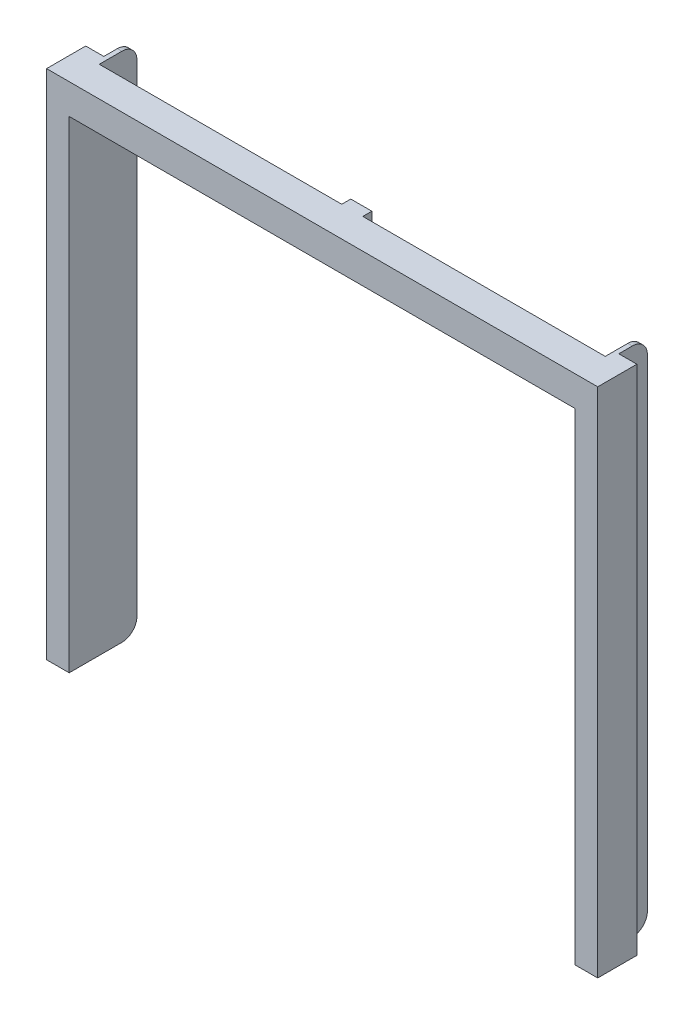
ISO-10303-21;
HEADER;
FILE_DESCRIPTION(('STEP AP214'),'2;1');
FILE_NAME('part.step','',(''),(''),'','','');
FILE_SCHEMA(('AUTOMOTIVE_DESIGN { 1 0 10303 214 1 1 1 1 }'));
ENDSEC;
DATA;
#1=APPLICATION_CONTEXT('core data for automotive mechanical design processes');
#2=APPLICATION_PROTOCOL_DEFINITION('international standard','automotive_design',2000,#1);
#3=PRODUCT_CONTEXT('',#1,'mechanical');
#4=PRODUCT('Part','Part','',(#3));
#5=PRODUCT_RELATED_PRODUCT_CATEGORY('part','',(#4));
#6=PRODUCT_DEFINITION_FORMATION('','',#4);
#7=PRODUCT_DEFINITION_CONTEXT('part definition',#1,'design');
#8=PRODUCT_DEFINITION('design','',#6,#7);
#9=PRODUCT_DEFINITION_SHAPE('','',#8);
#10=(LENGTH_UNIT() NAMED_UNIT(*) SI_UNIT(.MILLI.,.METRE.));
#11=(NAMED_UNIT(*) PLANE_ANGLE_UNIT() SI_UNIT($,.RADIAN.));
#12=(NAMED_UNIT(*) SI_UNIT($,.STERADIAN.) SOLID_ANGLE_UNIT());
#13=UNCERTAINTY_MEASURE_WITH_UNIT(LENGTH_MEASURE(1.E-05),#10,'distance_accuracy_value','');
#14=(GEOMETRIC_REPRESENTATION_CONTEXT(3) GLOBAL_UNCERTAINTY_ASSIGNED_CONTEXT((#13)) GLOBAL_UNIT_ASSIGNED_CONTEXT((#10,
#11,#12)) REPRESENTATION_CONTEXT('',''));
#15=CARTESIAN_POINT('',(0.,0.,0.));
#16=DIRECTION('',(0.,0.,1.));
#17=DIRECTION('',(1.,0.,0.));
#18=AXIS2_PLACEMENT_3D('',#15,#16,#17);
#19=CARTESIAN_POINT('',(0.,0.,0.));
#20=DIRECTION('',(0.,0.,1.));
#21=DIRECTION('',(1.,0.,0.));
#22=AXIS2_PLACEMENT_3D('',#19,#20,#21);
#23=PLANE('',#22);
#24=DIRECTION('',(0.,1.,0.));
#25=VECTOR('',#24,1.);
#26=CARTESIAN_POINT('',(-7.,-52.,0.));
#27=LINE('',#26,#25);
#28=CARTESIAN_POINT('',(-7.,-20.,0.));
#29=VERTEX_POINT('',#28);
#30=CARTESIAN_POINT('',(-7.00000000000001,0.,0.));
#31=VERTEX_POINT('',#30);
#32=EDGE_CURVE('E195',#29,#31,#27,.T.);
#33=ORIENTED_EDGE('',*,*,#32,.T.);
#34=DIRECTION('',(1.,0.,0.));
#35=VECTOR('',#34,1.);
#36=CARTESIAN_POINT('',(168.,0.,0.));
#37=LINE('',#36,#35);
#38=CARTESIAN_POINT('',(7.,0.,0.));
#39=VERTEX_POINT('',#38);
#40=EDGE_CURVE('E207',#31,#39,#37,.T.);
#41=ORIENTED_EDGE('',*,*,#40,.T.);
#42=DIRECTION('',(0.,1.,0.));
#43=VECTOR('',#42,1.);
#44=CARTESIAN_POINT('',(7.00000000000001,-52.,0.));
#45=LINE('',#44,#43);
#46=CARTESIAN_POINT('',(7.,-20.,0.));
#47=VERTEX_POINT('',#46);
#48=EDGE_CURVE('E220',#47,#39,#45,.T.);
#49=ORIENTED_EDGE('',*,*,#48,.F.);
#50=DIRECTION('',(1.,0.,0.));
#51=VECTOR('',#50,1.);
#52=CARTESIAN_POINT('',(-168.,-20.,0.));
#53=LINE('',#52,#51);
#54=EDGE_CURVE('E265',#29,#47,#53,.T.);
#55=ORIENTED_EDGE('',*,*,#54,.F.);
#56=EDGE_LOOP('',(#33,#41,#49,#55));
#57=FACE_BOUND('',#56,.T.);
#58=ADVANCED_FACE('F35',(#57),#23,.F.);
#59=CARTESIAN_POINT('',(-168.,-20.,26.));
#60=DIRECTION('',(0.,1.,0.));
#61=DIRECTION('',(-1.,0.,0.));
#62=AXIS2_PLACEMENT_3D('',#59,#60,#61);
#63=PLANE('',#62);
#64=DIRECTION('',(0.,0.,1.));
#65=VECTOR('',#64,1.);
#66=CARTESIAN_POINT('',(-7.00000000000001,-20.,26.));
#67=LINE('',#66,#65);
#68=CARTESIAN_POINT('',(-7.,-20.,6.00000000000002));
#69=VERTEX_POINT('',#68);
#70=EDGE_CURVE('E192',#29,#69,#67,.T.);
#71=ORIENTED_EDGE('',*,*,#70,.F.);
#72=ORIENTED_EDGE('',*,*,#54,.T.);
#73=DIRECTION('',(0.,0.,1.));
#74=VECTOR('',#73,1.);
#75=CARTESIAN_POINT('',(7.00000000000001,-20.,26.));
#76=LINE('',#75,#74);
#77=CARTESIAN_POINT('',(7.,-20.,6.00000000000002));
#78=VERTEX_POINT('',#77);
#79=EDGE_CURVE('E211',#47,#78,#76,.T.);
#80=ORIENTED_EDGE('',*,*,#79,.T.);
#81=DIRECTION('',(1.,0.,0.));
#82=VECTOR('',#81,1.);
#83=CARTESIAN_POINT('',(-168.,-20.,6.00000000000002));
#84=LINE('',#83,#82);
#85=CARTESIAN_POINT('',(168.,-19.9999999999999,6.00000000000002));
#86=VERTEX_POINT('',#85);
#87=EDGE_CURVE('E226',#78,#86,#84,.T.);
#88=ORIENTED_EDGE('',*,*,#87,.T.);
#89=DIRECTION('',(0.,0.,-1.));
#90=VECTOR('',#89,1.);
#91=CARTESIAN_POINT('',(168.,-19.9999999999999,26.));
#92=LINE('',#91,#90);
#93=CARTESIAN_POINT('',(168.,-19.9999999999999,26.));
#94=VERTEX_POINT('',#93);
#95=EDGE_CURVE('E302',#94,#86,#92,.T.);
#96=ORIENTED_EDGE('',*,*,#95,.F.);
#97=DIRECTION('',(1.,0.,0.));
#98=VECTOR('',#97,1.);
#99=CARTESIAN_POINT('',(-168.,-20.,26.));
#100=LINE('',#99,#98);
#101=CARTESIAN_POINT('',(-168.,-20.,26.));
#102=VERTEX_POINT('',#101);
#103=EDGE_CURVE('E279',#102,#94,#100,.T.);
#104=ORIENTED_EDGE('',*,*,#103,.F.);
#105=DIRECTION('',(0.,0.,-1.));
#106=VECTOR('',#105,1.);
#107=CARTESIAN_POINT('',(-168.,-20.,26.));
#108=LINE('',#107,#106);
#109=CARTESIAN_POINT('',(-168.,-20.,6.00000000000002));
#110=VERTEX_POINT('',#109);
#111=EDGE_CURVE('E298',#102,#110,#108,.T.);
#112=ORIENTED_EDGE('',*,*,#111,.T.);
#113=DIRECTION('',(1.,0.,0.));
#114=VECTOR('',#113,1.);
#115=CARTESIAN_POINT('',(-168.,-20.,6.00000000000002));
#116=LINE('',#115,#114);
#117=EDGE_CURVE('E229',#110,#69,#116,.T.);
#118=ORIENTED_EDGE('',*,*,#117,.T.);
#119=EDGE_LOOP('',(#71,#72,#80,#88,#96,#104,#112,#118));
#120=FACE_BOUND('',#119,.T.);
#121=ADVANCED_FACE('F383',(#120),#63,.F.);
#122=DIRECTION('',(0.,1.,0.));
#123=VECTOR('',#122,1.);
#124=CARTESIAN_POINT('',(-171.,0.,0.));
#125=LINE('',#124,#123);
#126=CARTESIAN_POINT('',(-171.,-340.,0.));
#127=VERTEX_POINT('',#126);
#128=CARTESIAN_POINT('',(-171.,0.,0.));
#129=VERTEX_POINT('',#128);
#130=EDGE_CURVE('E232',#127,#129,#125,.T.);
#131=ORIENTED_EDGE('',*,*,#130,.F.);
#132=DIRECTION('',(1.,0.,0.));
#133=VECTOR('',#132,1.);
#134=CARTESIAN_POINT('',(-183.,-340.,0.));
#135=LINE('',#134,#133);
#136=CARTESIAN_POINT('',(-183.,-340.,0.));
#137=VERTEX_POINT('',#136);
#138=EDGE_CURVE('E257',#137,#127,#135,.T.);
#139=ORIENTED_EDGE('',*,*,#138,.F.);
#140=DIRECTION('',(0.,-1.,0.));
#141=VECTOR('',#140,1.);
#142=CARTESIAN_POINT('',(-183.,0.,0.));
#143=LINE('',#142,#141);
#144=CARTESIAN_POINT('',(-183.,0.,0.));
#145=VERTEX_POINT('',#144);
#146=EDGE_CURVE('E284',#145,#137,#143,.T.);
#147=ORIENTED_EDGE('',*,*,#146,.F.);
#148=EDGE_CURVE('E287',#145,#129,#37,.T.);
#149=ORIENTED_EDGE('',*,*,#148,.T.);
#150=EDGE_LOOP('',(#131,#139,#147,#149));
#151=FACE_BOUND('',#150,.T.);
#152=ADVANCED_FACE('F415',(#151),#23,.F.);
#153=CARTESIAN_POINT('',(-168.,-20.,26.));
#154=DIRECTION('',(1.,0.,0.));
#155=DIRECTION('',(0.,1.,0.));
#156=AXIS2_PLACEMENT_3D('',#153,#154,#155);
#157=PLANE('',#156);
#158=DIRECTION('',(0.,0.,1.));
#159=VECTOR('',#158,1.);
#160=CARTESIAN_POINT('',(-168.,0.,-19.));
#161=LINE('',#160,#159);
#162=CARTESIAN_POINT('',(-168.,0.,-9.));
#163=VERTEX_POINT('',#162);
#164=CARTESIAN_POINT('',(-168.,0.,6.00000000000002));
#165=VERTEX_POINT('',#164);
#166=EDGE_CURVE('E50',#163,#165,#161,.T.);
#167=ORIENTED_EDGE('',*,*,#166,.T.);
#168=DIRECTION('',(0.,1.,0.));
#169=VECTOR('',#168,1.);
#170=CARTESIAN_POINT('',(-168.,-52.,6.00000000000002));
#171=LINE('',#170,#169);
#172=EDGE_CURVE('E196',#110,#165,#171,.T.);
#173=ORIENTED_EDGE('',*,*,#172,.F.);
#174=ORIENTED_EDGE('',*,*,#111,.F.);
#175=DIRECTION('',(0.,-1.,0.));
#176=VECTOR('',#175,1.);
#177=CARTESIAN_POINT('',(-168.,-20.,26.));
#178=LINE('',#177,#176);
#179=CARTESIAN_POINT('',(-168.,-340.,26.));
#180=VERTEX_POINT('',#179);
#181=EDGE_CURVE('E261',#102,#180,#178,.T.);
#182=ORIENTED_EDGE('',*,*,#181,.T.);
#183=DIRECTION('',(0.,0.,-1.));
#184=VECTOR('',#183,1.);
#185=CARTESIAN_POINT('',(-168.,-340.,26.));
#186=LINE('',#185,#184);
#187=CARTESIAN_POINT('',(-168.,-340.,-8.99999999999998));
#188=VERTEX_POINT('',#187);
#189=EDGE_CURVE('E281',#180,#188,#186,.T.);
#190=ORIENTED_EDGE('',*,*,#189,.T.);
#191=CARTESIAN_POINT('',(-168.,-330.,-9.));
#192=DIRECTION('',(1.,0.,0.));
#193=DIRECTION('',(0.,1.,0.));
#194=AXIS2_PLACEMENT_3D('',#191,#192,#193);
#195=CIRCLE('',#194,10.);
#196=CARTESIAN_POINT('',(-168.,-330.,-19.));
#197=VERTEX_POINT('',#196);
#198=EDGE_CURVE('E333',#188,#197,#195,.T.);
#199=ORIENTED_EDGE('',*,*,#198,.T.);
#200=DIRECTION('',(0.,-1.,0.));
#201=VECTOR('',#200,1.);
#202=CARTESIAN_POINT('',(-168.,0.,-19.));
#203=LINE('',#202,#201);
#204=CARTESIAN_POINT('',(-168.,-10.,-19.));
#205=VERTEX_POINT('',#204);
#206=EDGE_CURVE('E233',#205,#197,#203,.T.);
#207=ORIENTED_EDGE('',*,*,#206,.F.);
#208=CARTESIAN_POINT('',(-168.,-10.,-9.));
#209=DIRECTION('',(1.,0.,0.));
#210=DIRECTION('',(0.,1.,0.));
#211=AXIS2_PLACEMENT_3D('',#208,#209,#210);
#212=CIRCLE('',#211,10.);
#213=EDGE_CURVE('E335',#205,#163,#212,.T.);
#214=ORIENTED_EDGE('',*,*,#213,.T.);
#215=EDGE_LOOP('',(#167,#173,#174,#182,#190,#199,#207,#214));
#216=FACE_BOUND('',#215,.T.);
#217=ADVANCED_FACE('F385',(#216),#157,.T.);
#218=CARTESIAN_POINT('',(168.,-19.9999999999999,26.));
#219=DIRECTION('',(1.,0.,0.));
#220=DIRECTION('',(0.,1.,0.));
#221=AXIS2_PLACEMENT_3D('',#218,#219,#220);
#222=PLANE('',#221);
#223=ORIENTED_EDGE('',*,*,#95,.T.);
#224=DIRECTION('',(0.,1.,0.));
#225=VECTOR('',#224,1.);
#226=CARTESIAN_POINT('',(168.,-52.,6.00000000000002));
#227=LINE('',#226,#225);
#228=CARTESIAN_POINT('',(168.,0.,6.00000000000002));
#229=VERTEX_POINT('',#228);
#230=EDGE_CURVE('E218',#86,#229,#227,.T.);
#231=ORIENTED_EDGE('',*,*,#230,.T.);
#232=DIRECTION('',(0.,0.,1.));
#233=VECTOR('',#232,1.);
#234=CARTESIAN_POINT('',(168.,0.,-19.));
#235=LINE('',#234,#233);
#236=CARTESIAN_POINT('',(168.,0.,-9.));
#237=VERTEX_POINT('',#236);
#238=EDGE_CURVE('E58',#237,#229,#235,.T.);
#239=ORIENTED_EDGE('',*,*,#238,.F.);
#240=CARTESIAN_POINT('',(168.,-9.99999999999996,-9.));
#241=DIRECTION('',(1.,0.,0.));
#242=DIRECTION('',(0.,1.,0.));
#243=AXIS2_PLACEMENT_3D('',#240,#241,#242);
#244=CIRCLE('',#243,10.);
#245=CARTESIAN_POINT('',(168.,-9.99999999999996,-19.));
#246=VERTEX_POINT('',#245);
#247=EDGE_CURVE('E349',#237,#246,#244,.F.);
#248=ORIENTED_EDGE('',*,*,#247,.T.);
#249=DIRECTION('',(0.,1.,0.));
#250=VECTOR('',#249,1.);
#251=CARTESIAN_POINT('',(168.,0.,-19.));
#252=LINE('',#251,#250);
#253=CARTESIAN_POINT('',(168.,-330.,-19.));
#254=VERTEX_POINT('',#253);
#255=EDGE_CURVE('E247',#254,#246,#252,.T.);
#256=ORIENTED_EDGE('',*,*,#255,.F.);
#257=CARTESIAN_POINT('',(168.,-330.,-9.));
#258=DIRECTION('',(1.,0.,0.));
#259=DIRECTION('',(0.,1.,0.));
#260=AXIS2_PLACEMENT_3D('',#257,#258,#259);
#261=CIRCLE('',#260,10.);
#262=CARTESIAN_POINT('',(168.,-340.,-8.99999999999998));
#263=VERTEX_POINT('',#262);
#264=EDGE_CURVE('E347',#254,#263,#261,.F.);
#265=ORIENTED_EDGE('',*,*,#264,.T.);
#266=DIRECTION('',(0.,0.,-1.));
#267=VECTOR('',#266,1.);
#268=CARTESIAN_POINT('',(168.,-340.,26.));
#269=LINE('',#268,#267);
#270=CARTESIAN_POINT('',(168.,-340.,26.));
#271=VERTEX_POINT('',#270);
#272=EDGE_CURVE('E305',#271,#263,#269,.T.);
#273=ORIENTED_EDGE('',*,*,#272,.F.);
#274=DIRECTION('',(0.,-1.,0.));
#275=VECTOR('',#274,1.);
#276=CARTESIAN_POINT('',(168.,-19.9999999999999,26.));
#277=LINE('',#276,#275);
#278=EDGE_CURVE('E277',#94,#271,#277,.T.);
#279=ORIENTED_EDGE('',*,*,#278,.F.);
#280=EDGE_LOOP('',(#223,#231,#239,#248,#256,#265,#273,#279));
#281=FACE_BOUND('',#280,.T.);
#282=ADVANCED_FACE('F369',(#281),#222,.F.);
#283=CARTESIAN_POINT('',(183.,-340.,26.));
#284=DIRECTION('',(0.,-1.,0.));
#285=DIRECTION('',(0.,0.,-1.));
#286=AXIS2_PLACEMENT_3D('',#283,#284,#285);
#287=PLANE('',#286);
#288=ORIENTED_EDGE('',*,*,#272,.T.);
#289=DIRECTION('',(-1.,0.,0.));
#290=VECTOR('',#289,1.);
#291=CARTESIAN_POINT('',(171.,-340.,-9.));
#292=LINE('',#291,#290);
#293=CARTESIAN_POINT('',(171.,-340.,-9.));
#294=VERTEX_POINT('',#293);
#295=EDGE_CURVE('E43',#263,#294,#292,.F.);
#296=ORIENTED_EDGE('',*,*,#295,.T.);
#297=DIRECTION('',(0.,0.,1.));
#298=VECTOR('',#297,1.);
#299=CARTESIAN_POINT('',(171.,-340.,-19.));
#300=LINE('',#299,#298);
#301=CARTESIAN_POINT('',(171.,-340.,0.));
#302=VERTEX_POINT('',#301);
#303=EDGE_CURVE('E253',#294,#302,#300,.T.);
#304=ORIENTED_EDGE('',*,*,#303,.T.);
#305=DIRECTION('',(-1.,0.,0.));
#306=VECTOR('',#305,1.);
#307=CARTESIAN_POINT('',(183.,-340.,0.));
#308=LINE('',#307,#306);
#309=CARTESIAN_POINT('',(183.,-340.,0.));
#310=VERTEX_POINT('',#309);
#311=EDGE_CURVE('E293',#310,#302,#308,.T.);
#312=ORIENTED_EDGE('',*,*,#311,.F.);
#313=DIRECTION('',(0.,0.,-1.));
#314=VECTOR('',#313,1.);
#315=CARTESIAN_POINT('',(183.,-340.,26.));
#316=LINE('',#315,#314);
#317=CARTESIAN_POINT('',(183.,-340.,26.));
#318=VERTEX_POINT('',#317);
#319=EDGE_CURVE('E308',#318,#310,#316,.T.);
#320=ORIENTED_EDGE('',*,*,#319,.F.);
#321=DIRECTION('',(-1.,0.,0.));
#322=VECTOR('',#321,1.);
#323=CARTESIAN_POINT('',(183.,-340.,26.));
#324=LINE('',#323,#322);
#325=EDGE_CURVE('E274',#318,#271,#324,.T.);
#326=ORIENTED_EDGE('',*,*,#325,.T.);
#327=EDGE_LOOP('',(#288,#296,#304,#312,#320,#326));
#328=FACE_BOUND('',#327,.T.);
#329=ADVANCED_FACE('F353',(#328),#287,.T.);
#330=CARTESIAN_POINT('',(183.,0.,26.));
#331=DIRECTION('',(1.,0.,0.));
#332=DIRECTION('',(0.,1.,0.));
#333=AXIS2_PLACEMENT_3D('',#330,#331,#332);
#334=PLANE('',#333);
#335=DIRECTION('',(0.,-1.,0.));
#336=VECTOR('',#335,1.);
#337=CARTESIAN_POINT('',(183.,0.,0.));
#338=LINE('',#337,#336);
#339=CARTESIAN_POINT('',(183.,0.,0.));
#340=VERTEX_POINT('',#339);
#341=EDGE_CURVE('E290',#340,#310,#338,.T.);
#342=ORIENTED_EDGE('',*,*,#341,.F.);
#343=DIRECTION('',(0.,0.,-1.));
#344=VECTOR('',#343,1.);
#345=CARTESIAN_POINT('',(183.,0.,26.));
#346=LINE('',#345,#344);
#347=CARTESIAN_POINT('',(183.,0.,26.));
#348=VERTEX_POINT('',#347);
#349=EDGE_CURVE('E310',#348,#340,#346,.T.);
#350=ORIENTED_EDGE('',*,*,#349,.F.);
#351=DIRECTION('',(0.,-1.,0.));
#352=VECTOR('',#351,1.);
#353=CARTESIAN_POINT('',(183.,0.,26.));
#354=LINE('',#353,#352);
#355=EDGE_CURVE('E271',#348,#318,#354,.T.);
#356=ORIENTED_EDGE('',*,*,#355,.T.);
#357=ORIENTED_EDGE('',*,*,#319,.T.);
#358=EDGE_LOOP('',(#342,#350,#356,#357));
#359=FACE_BOUND('',#358,.T.);
#360=ADVANCED_FACE('F447',(#359),#334,.T.);
#361=CARTESIAN_POINT('',(168.,0.,26.));
#362=DIRECTION('',(0.,1.,0.));
#363=DIRECTION('',(-1.,0.,0.));
#364=AXIS2_PLACEMENT_3D('',#361,#362,#363);
#365=PLANE('',#364);
#366=DIRECTION('',(1.,0.,0.));
#367=VECTOR('',#366,1.);
#368=CARTESIAN_POINT('',(0.,0.,6.00000000000002));
#369=LINE('',#368,#367);
#370=CARTESIAN_POINT('',(-7.00000000000001,0.,6.00000000000002));
#371=VERTEX_POINT('',#370);
#372=EDGE_CURVE('E199',#165,#371,#369,.T.);
#373=ORIENTED_EDGE('',*,*,#372,.F.);
#374=ORIENTED_EDGE('',*,*,#166,.F.);
#375=DIRECTION('',(-1.,0.,0.));
#376=VECTOR('',#375,1.);
#377=CARTESIAN_POINT('',(-171.,0.,-9.));
#378=LINE('',#377,#376);
#379=CARTESIAN_POINT('',(-171.,0.,-9.));
#380=VERTEX_POINT('',#379);
#381=EDGE_CURVE('E322',#163,#380,#378,.T.);
#382=ORIENTED_EDGE('',*,*,#381,.T.);
#383=DIRECTION('',(0.,0.,1.));
#384=VECTOR('',#383,1.);
#385=CARTESIAN_POINT('',(-171.,0.,-19.));
#386=LINE('',#385,#384);
#387=EDGE_CURVE('E244',#380,#129,#386,.T.);
#388=ORIENTED_EDGE('',*,*,#387,.T.);
#389=ORIENTED_EDGE('',*,*,#148,.F.);
#390=DIRECTION('',(0.,0.,-1.));
#391=VECTOR('',#390,1.);
#392=CARTESIAN_POINT('',(-183.,0.,26.));
#393=LINE('',#392,#391);
#394=CARTESIAN_POINT('',(-183.,0.,26.));
#395=VERTEX_POINT('',#394);
#396=EDGE_CURVE('E313',#395,#145,#393,.T.);
#397=ORIENTED_EDGE('',*,*,#396,.F.);
#398=DIRECTION('',(-1.,0.,0.));
#399=VECTOR('',#398,1.);
#400=CARTESIAN_POINT('',(-168.,0.,26.));
#401=LINE('',#400,#399);
#402=EDGE_CURVE('E269',#348,#395,#401,.T.);
#403=ORIENTED_EDGE('',*,*,#402,.F.);
#404=ORIENTED_EDGE('',*,*,#349,.T.);
#405=CARTESIAN_POINT('',(171.,0.,0.));
#406=VERTEX_POINT('',#405);
#407=EDGE_CURVE('E286',#406,#340,#37,.T.);
#408=ORIENTED_EDGE('',*,*,#407,.F.);
#409=DIRECTION('',(0.,0.,1.));
#410=VECTOR('',#409,1.);
#411=CARTESIAN_POINT('',(171.,0.,-19.));
#412=LINE('',#411,#410);
#413=CARTESIAN_POINT('',(171.,0.,-9.));
#414=VERTEX_POINT('',#413);
#415=EDGE_CURVE('E258',#414,#406,#412,.T.);
#416=ORIENTED_EDGE('',*,*,#415,.F.);
#417=DIRECTION('',(1.,0.,0.));
#418=VECTOR('',#417,1.);
#419=CARTESIAN_POINT('',(168.,0.,-9.));
#420=LINE('',#419,#418);
#421=EDGE_CURVE('E301',#414,#237,#420,.F.);
#422=ORIENTED_EDGE('',*,*,#421,.T.);
#423=ORIENTED_EDGE('',*,*,#238,.T.);
#424=DIRECTION('',(1.,0.,0.));
#425=VECTOR('',#424,1.);
#426=CARTESIAN_POINT('',(0.,0.,6.00000000000002));
#427=LINE('',#426,#425);
#428=CARTESIAN_POINT('',(7.,0.,6.00000000000002));
#429=VERTEX_POINT('',#428);
#430=EDGE_CURVE('E213',#429,#229,#427,.T.);
#431=ORIENTED_EDGE('',*,*,#430,.F.);
#432=DIRECTION('',(0.,0.,1.));
#433=VECTOR('',#432,1.);
#434=CARTESIAN_POINT('',(7.,0.,0.));
#435=LINE('',#434,#433);
#436=EDGE_CURVE('E215',#39,#429,#435,.T.);
#437=ORIENTED_EDGE('',*,*,#436,.F.);
#438=ORIENTED_EDGE('',*,*,#40,.F.);
#439=DIRECTION('',(0.,0.,1.));
#440=VECTOR('',#439,1.);
#441=CARTESIAN_POINT('',(-7.00000000000001,0.,0.));
#442=LINE('',#441,#440);
#443=EDGE_CURVE('E189',#31,#371,#442,.T.);
#444=ORIENTED_EDGE('',*,*,#443,.T.);
#445=EDGE_LOOP('',(#373,#374,#382,#388,#389,#397,#403,#404,#408,#416,#422,#423,#431,#437,#438,#444));
#446=FACE_BOUND('',#445,.T.);
#447=ADVANCED_FACE('F204',(#446),#365,.T.);
#448=CARTESIAN_POINT('',(-183.,0.,26.));
#449=DIRECTION('',(1.,0.,0.));
#450=DIRECTION('',(0.,1.,0.));
#451=AXIS2_PLACEMENT_3D('',#448,#449,#450);
#452=PLANE('',#451);
#453=ORIENTED_EDGE('',*,*,#146,.T.);
#454=DIRECTION('',(0.,0.,-1.));
#455=VECTOR('',#454,1.);
#456=CARTESIAN_POINT('',(-183.,-340.,26.));
#457=LINE('',#456,#455);
#458=CARTESIAN_POINT('',(-183.,-340.,26.));
#459=VERTEX_POINT('',#458);
#460=EDGE_CURVE('E316',#459,#137,#457,.T.);
#461=ORIENTED_EDGE('',*,*,#460,.F.);
#462=DIRECTION('',(0.,-1.,0.));
#463=VECTOR('',#462,1.);
#464=CARTESIAN_POINT('',(-183.,0.,26.));
#465=LINE('',#464,#463);
#466=EDGE_CURVE('E267',#395,#459,#465,.T.);
#467=ORIENTED_EDGE('',*,*,#466,.F.);
#468=ORIENTED_EDGE('',*,*,#396,.T.);
#469=EDGE_LOOP('',(#453,#461,#467,#468));
#470=FACE_BOUND('',#469,.T.);
#471=ADVANCED_FACE('F454',(#470),#452,.F.);
#472=CARTESIAN_POINT('',(-183.,-340.,26.));
#473=DIRECTION('',(0.,1.,0.));
#474=DIRECTION('',(0.,0.,1.));
#475=AXIS2_PLACEMENT_3D('',#472,#473,#474);
#476=PLANE('',#475);
#477=DIRECTION('',(0.,0.,1.));
#478=VECTOR('',#477,1.);
#479=CARTESIAN_POINT('',(-171.,-340.,-19.));
#480=LINE('',#479,#478);
#481=CARTESIAN_POINT('',(-171.,-340.,-9.));
#482=VERTEX_POINT('',#481);
#483=EDGE_CURVE('E241',#482,#127,#480,.T.);
#484=ORIENTED_EDGE('',*,*,#483,.F.);
#485=DIRECTION('',(1.,0.,0.));
#486=VECTOR('',#485,1.);
#487=CARTESIAN_POINT('',(-183.,-340.,-9.));
#488=LINE('',#487,#486);
#489=EDGE_CURVE('E11',#482,#188,#488,.T.);
#490=ORIENTED_EDGE('',*,*,#489,.T.);
#491=ORIENTED_EDGE('',*,*,#189,.F.);
#492=DIRECTION('',(1.,0.,0.));
#493=VECTOR('',#492,1.);
#494=CARTESIAN_POINT('',(-183.,-340.,26.));
#495=LINE('',#494,#493);
#496=EDGE_CURVE('E264',#459,#180,#495,.T.);
#497=ORIENTED_EDGE('',*,*,#496,.F.);
#498=ORIENTED_EDGE('',*,*,#460,.T.);
#499=ORIENTED_EDGE('',*,*,#138,.T.);
#500=EDGE_LOOP('',(#484,#490,#491,#497,#498,#499));
#501=FACE_BOUND('',#500,.T.);
#502=ADVANCED_FACE('F397',(#501),#476,.F.);
#503=CARTESIAN_POINT('',(0.,0.,26.));
#504=DIRECTION('',(0.,0.,1.));
#505=DIRECTION('',(1.,0.,0.));
#506=AXIS2_PLACEMENT_3D('',#503,#504,#505);
#507=PLANE('',#506);
#508=ORIENTED_EDGE('',*,*,#181,.F.);
#509=ORIENTED_EDGE('',*,*,#103,.T.);
#510=ORIENTED_EDGE('',*,*,#278,.T.);
#511=ORIENTED_EDGE('',*,*,#325,.F.);
#512=ORIENTED_EDGE('',*,*,#355,.F.);
#513=ORIENTED_EDGE('',*,*,#402,.T.);
#514=ORIENTED_EDGE('',*,*,#466,.T.);
#515=ORIENTED_EDGE('',*,*,#496,.T.);
#516=EDGE_LOOP('',(#508,#509,#510,#511,#512,#513,#514,#515));
#517=FACE_BOUND('',#516,.T.);
#518=ADVANCED_FACE('F390',(#517),#507,.T.);
#519=ORIENTED_EDGE('',*,*,#311,.T.);
#520=DIRECTION('',(0.,1.,0.));
#521=VECTOR('',#520,1.);
#522=CARTESIAN_POINT('',(171.,0.,0.));
#523=LINE('',#522,#521);
#524=EDGE_CURVE('E243',#302,#406,#523,.T.);
#525=ORIENTED_EDGE('',*,*,#524,.T.);
#526=ORIENTED_EDGE('',*,*,#407,.T.);
#527=ORIENTED_EDGE('',*,*,#341,.T.);
#528=EDGE_LOOP('',(#519,#525,#526,#527));
#529=FACE_BOUND('',#528,.T.);
#530=ADVANCED_FACE('F431',(#529),#23,.F.);
#531=CARTESIAN_POINT('',(171.,0.,-19.));
#532=DIRECTION('',(1.,0.,0.));
#533=DIRECTION('',(0.,0.,-1.));
#534=AXIS2_PLACEMENT_3D('',#531,#532,#533);
#535=PLANE('',#534);
#536=DIRECTION('',(0.,1.,0.));
#537=VECTOR('',#536,1.);
#538=CARTESIAN_POINT('',(171.,0.,-19.));
#539=LINE('',#538,#537);
#540=CARTESIAN_POINT('',(171.,-330.,-19.));
#541=VERTEX_POINT('',#540);
#542=CARTESIAN_POINT('',(171.,-9.99999999999996,-19.));
#543=VERTEX_POINT('',#542);
#544=EDGE_CURVE('E250',#541,#543,#539,.T.);
#545=ORIENTED_EDGE('',*,*,#544,.T.);
#546=CARTESIAN_POINT('',(171.,-9.99999999999996,-9.));
#547=DIRECTION('',(1.,0.,0.));
#548=DIRECTION('',(0.,0.,-1.));
#549=AXIS2_PLACEMENT_3D('',#546,#547,#548);
#550=CIRCLE('',#549,10.);
#551=EDGE_CURVE('E345',#543,#414,#550,.T.);
#552=ORIENTED_EDGE('',*,*,#551,.T.);
#553=ORIENTED_EDGE('',*,*,#415,.T.);
#554=ORIENTED_EDGE('',*,*,#524,.F.);
#555=ORIENTED_EDGE('',*,*,#303,.F.);
#556=CARTESIAN_POINT('',(171.,-330.,-9.));
#557=DIRECTION('',(1.,0.,0.));
#558=DIRECTION('',(0.,0.,-1.));
#559=AXIS2_PLACEMENT_3D('',#556,#557,#558);
#560=CIRCLE('',#559,10.);
#561=EDGE_CURVE('E343',#294,#541,#560,.T.);
#562=ORIENTED_EDGE('',*,*,#561,.T.);
#563=EDGE_LOOP('',(#545,#552,#553,#554,#555,#562));
#564=FACE_BOUND('',#563,.T.);
#565=ADVANCED_FACE('F360',(#564),#535,.T.);
#566=CARTESIAN_POINT('',(0.,0.,-19.));
#567=DIRECTION('',(0.,0.,1.));
#568=DIRECTION('',(1.,0.,0.));
#569=AXIS2_PLACEMENT_3D('',#566,#567,#568);
#570=PLANE('',#569);
#571=ORIENTED_EDGE('',*,*,#255,.T.);
#572=DIRECTION('',(1.,0.,0.));
#573=VECTOR('',#572,1.);
#574=CARTESIAN_POINT('',(171.,-9.99999999999996,-19.));
#575=LINE('',#574,#573);
#576=EDGE_CURVE('E340',#246,#543,#575,.T.);
#577=ORIENTED_EDGE('',*,*,#576,.T.);
#578=ORIENTED_EDGE('',*,*,#544,.F.);
#579=DIRECTION('',(-1.,0.,0.));
#580=VECTOR('',#579,1.);
#581=CARTESIAN_POINT('',(168.,-330.,-19.));
#582=LINE('',#581,#580);
#583=EDGE_CURVE('E337',#541,#254,#582,.T.);
#584=ORIENTED_EDGE('',*,*,#583,.T.);
#585=EDGE_LOOP('',(#571,#577,#578,#584));
#586=FACE_BOUND('',#585,.T.);
#587=ADVANCED_FACE('F366',(#586),#570,.F.);
#588=CARTESIAN_POINT('',(-171.,0.,-19.));
#589=DIRECTION('',(1.,0.,0.));
#590=DIRECTION('',(0.,1.,0.));
#591=AXIS2_PLACEMENT_3D('',#588,#589,#590);
#592=PLANE('',#591);
#593=ORIENTED_EDGE('',*,*,#387,.F.);
#594=CARTESIAN_POINT('',(-171.,-10.,-9.));
#595=DIRECTION('',(1.,0.,0.));
#596=DIRECTION('',(0.,1.,0.));
#597=AXIS2_PLACEMENT_3D('',#594,#595,#596);
#598=CIRCLE('',#597,10.);
#599=CARTESIAN_POINT('',(-171.,-10.,-19.));
#600=VERTEX_POINT('',#599);
#601=EDGE_CURVE('E327',#380,#600,#598,.F.);
#602=ORIENTED_EDGE('',*,*,#601,.T.);
#603=DIRECTION('',(0.,1.,0.));
#604=VECTOR('',#603,1.);
#605=CARTESIAN_POINT('',(-171.,0.,-19.));
#606=LINE('',#605,#604);
#607=CARTESIAN_POINT('',(-171.,-330.,-19.));
#608=VERTEX_POINT('',#607);
#609=EDGE_CURVE('E236',#608,#600,#606,.T.);
#610=ORIENTED_EDGE('',*,*,#609,.F.);
#611=CARTESIAN_POINT('',(-171.,-330.,-9.));
#612=DIRECTION('',(1.,0.,0.));
#613=DIRECTION('',(0.,1.,0.));
#614=AXIS2_PLACEMENT_3D('',#611,#612,#613);
#615=CIRCLE('',#614,10.);
#616=EDGE_CURVE('E325',#608,#482,#615,.F.);
#617=ORIENTED_EDGE('',*,*,#616,.T.);
#618=ORIENTED_EDGE('',*,*,#483,.T.);
#619=ORIENTED_EDGE('',*,*,#130,.T.);
#620=EDGE_LOOP('',(#593,#602,#610,#617,#618,#619));
#621=FACE_BOUND('',#620,.T.);
#622=ADVANCED_FACE('F410',(#621),#592,.F.);
#623=CARTESIAN_POINT('',(0.,0.,-19.));
#624=DIRECTION('',(0.,0.,1.));
#625=DIRECTION('',(1.,0.,0.));
#626=AXIS2_PLACEMENT_3D('',#623,#624,#625);
#627=PLANE('',#626);
#628=ORIENTED_EDGE('',*,*,#609,.T.);
#629=DIRECTION('',(-1.,0.,0.));
#630=VECTOR('',#629,1.);
#631=CARTESIAN_POINT('',(-168.,-10.,-19.));
#632=LINE('',#631,#630);
#633=EDGE_CURVE('E331',#600,#205,#632,.F.);
#634=ORIENTED_EDGE('',*,*,#633,.T.);
#635=ORIENTED_EDGE('',*,*,#206,.T.);
#636=DIRECTION('',(1.,0.,0.));
#637=VECTOR('',#636,1.);
#638=CARTESIAN_POINT('',(0.,-330.,-19.));
#639=LINE('',#638,#637);
#640=EDGE_CURVE('E329',#197,#608,#639,.F.);
#641=ORIENTED_EDGE('',*,*,#640,.T.);
#642=EDGE_LOOP('',(#628,#634,#635,#641));
#643=FACE_BOUND('',#642,.T.);
#644=ADVANCED_FACE('F404',(#643),#627,.F.);
#645=CARTESIAN_POINT('',(168.,-9.99999999999996,-9.));
#646=DIRECTION('',(1.,0.,0.));
#647=DIRECTION('',(0.,1.,0.));
#648=AXIS2_PLACEMENT_3D('',#645,#646,#647);
#649=CYLINDRICAL_SURFACE('',#648,10.);
#650=ORIENTED_EDGE('',*,*,#213,.F.);
#651=ORIENTED_EDGE('',*,*,#633,.F.);
#652=ORIENTED_EDGE('',*,*,#601,.F.);
#653=ORIENTED_EDGE('',*,*,#381,.F.);
#654=EDGE_LOOP('',(#650,#651,#652,#653));
#655=FACE_BOUND('',#654,.T.);
#656=ADVANCED_FACE('F419',(#655),#649,.T.);
#657=CARTESIAN_POINT('',(0.,-9.99999999999998,-9.));
#658=DIRECTION('',(-1.,0.,0.));
#659=DIRECTION('',(0.,-1.,0.));
#660=AXIS2_PLACEMENT_3D('',#657,#658,#659);
#661=CYLINDRICAL_SURFACE('',#660,10.);
#662=ORIENTED_EDGE('',*,*,#247,.F.);
#663=ORIENTED_EDGE('',*,*,#421,.F.);
#664=ORIENTED_EDGE('',*,*,#551,.F.);
#665=ORIENTED_EDGE('',*,*,#576,.F.);
#666=EDGE_LOOP('',(#662,#663,#664,#665));
#667=FACE_BOUND('',#666,.T.);
#668=ADVANCED_FACE('F373',(#667),#661,.T.);
#669=CARTESIAN_POINT('',(0.,-330.,-9.));
#670=DIRECTION('',(1.,0.,0.));
#671=DIRECTION('',(0.,0.,-1.));
#672=AXIS2_PLACEMENT_3D('',#669,#670,#671);
#673=CYLINDRICAL_SURFACE('',#672,10.);
#674=ORIENTED_EDGE('',*,*,#561,.F.);
#675=ORIENTED_EDGE('',*,*,#295,.F.);
#676=ORIENTED_EDGE('',*,*,#264,.F.);
#677=ORIENTED_EDGE('',*,*,#583,.F.);
#678=EDGE_LOOP('',(#674,#675,#676,#677));
#679=FACE_BOUND('',#678,.T.);
#680=ADVANCED_FACE('F363',(#679),#673,.T.);
#681=CARTESIAN_POINT('',(-183.,-330.,-9.));
#682=DIRECTION('',(1.,0.,0.));
#683=DIRECTION('',(0.,0.,-1.));
#684=AXIS2_PLACEMENT_3D('',#681,#682,#683);
#685=CYLINDRICAL_SURFACE('',#684,10.);
#686=ORIENTED_EDGE('',*,*,#616,.F.);
#687=ORIENTED_EDGE('',*,*,#640,.F.);
#688=ORIENTED_EDGE('',*,*,#198,.F.);
#689=ORIENTED_EDGE('',*,*,#489,.F.);
#690=EDGE_LOOP('',(#686,#687,#688,#689));
#691=FACE_BOUND('',#690,.T.);
#692=ADVANCED_FACE('F37',(#691),#685,.T.);
#693=CARTESIAN_POINT('',(0.,-52.,6.00000000000002));
#694=DIRECTION('',(0.,0.,1.));
#695=DIRECTION('',(1.,0.,0.));
#696=AXIS2_PLACEMENT_3D('',#693,#694,#695);
#697=PLANE('',#696);
#698=DIRECTION('',(0.,1.,0.));
#699=VECTOR('',#698,1.);
#700=CARTESIAN_POINT('',(7.00000000000001,-52.,6.00000000000002));
#701=LINE('',#700,#699);
#702=EDGE_CURVE('E201',#78,#429,#701,.T.);
#703=ORIENTED_EDGE('',*,*,#702,.T.);
#704=ORIENTED_EDGE('',*,*,#430,.T.);
#705=ORIENTED_EDGE('',*,*,#230,.F.);
#706=ORIENTED_EDGE('',*,*,#87,.F.);
#707=EDGE_LOOP('',(#703,#704,#705,#706));
#708=FACE_BOUND('',#707,.T.);
#709=ADVANCED_FACE('F541',(#708),#697,.F.);
#710=CARTESIAN_POINT('',(7.00000000000001,-52.,0.));
#711=DIRECTION('',(-1.,0.,0.));
#712=DIRECTION('',(0.,0.,1.));
#713=AXIS2_PLACEMENT_3D('',#710,#711,#712);
#714=PLANE('',#713);
#715=ORIENTED_EDGE('',*,*,#48,.T.);
#716=ORIENTED_EDGE('',*,*,#436,.T.);
#717=ORIENTED_EDGE('',*,*,#702,.F.);
#718=ORIENTED_EDGE('',*,*,#79,.F.);
#719=EDGE_LOOP('',(#715,#716,#717,#718));
#720=FACE_BOUND('',#719,.T.);
#721=ADVANCED_FACE('F574',(#720),#714,.F.);
#722=CARTESIAN_POINT('',(-7.,-52.,0.));
#723=DIRECTION('',(-1.,0.,0.));
#724=DIRECTION('',(0.,-1.,0.));
#725=AXIS2_PLACEMENT_3D('',#722,#723,#724);
#726=PLANE('',#725);
#727=ORIENTED_EDGE('',*,*,#70,.T.);
#728=DIRECTION('',(0.,1.,0.));
#729=VECTOR('',#728,1.);
#730=CARTESIAN_POINT('',(-7.,-52.,6.00000000000002));
#731=LINE('',#730,#729);
#732=EDGE_CURVE('E185',#69,#371,#731,.T.);
#733=ORIENTED_EDGE('',*,*,#732,.T.);
#734=ORIENTED_EDGE('',*,*,#443,.F.);
#735=ORIENTED_EDGE('',*,*,#32,.F.);
#736=EDGE_LOOP('',(#727,#733,#734,#735));
#737=FACE_BOUND('',#736,.T.);
#738=ADVANCED_FACE('F187',(#737),#726,.T.);
#739=CARTESIAN_POINT('',(0.,-52.,6.00000000000002));
#740=DIRECTION('',(0.,0.,1.));
#741=DIRECTION('',(1.,0.,0.));
#742=AXIS2_PLACEMENT_3D('',#739,#740,#741);
#743=PLANE('',#742);
#744=ORIENTED_EDGE('',*,*,#172,.T.);
#745=ORIENTED_EDGE('',*,*,#372,.T.);
#746=ORIENTED_EDGE('',*,*,#732,.F.);
#747=ORIENTED_EDGE('',*,*,#117,.F.);
#748=EDGE_LOOP('',(#744,#745,#746,#747));
#749=FACE_BOUND('',#748,.T.);
#750=ADVANCED_FACE('F200',(#749),#743,.F.);
#751=CLOSED_SHELL('',(#58,#121,#152,#217,#282,#329,#360,#447,#471,#502,#518,#530,#565,#587,#622,
#644,#656,#668,#680,#692,#709,#721,#738,#750));
#752=MANIFOLD_SOLID_BREP('B2',#751);
#753=ADVANCED_BREP_SHAPE_REPRESENTATION('',(#18,#752),#14);
#754=SHAPE_DEFINITION_REPRESENTATION(#9,#753);
ENDSEC;
END-ISO-10303-21;
